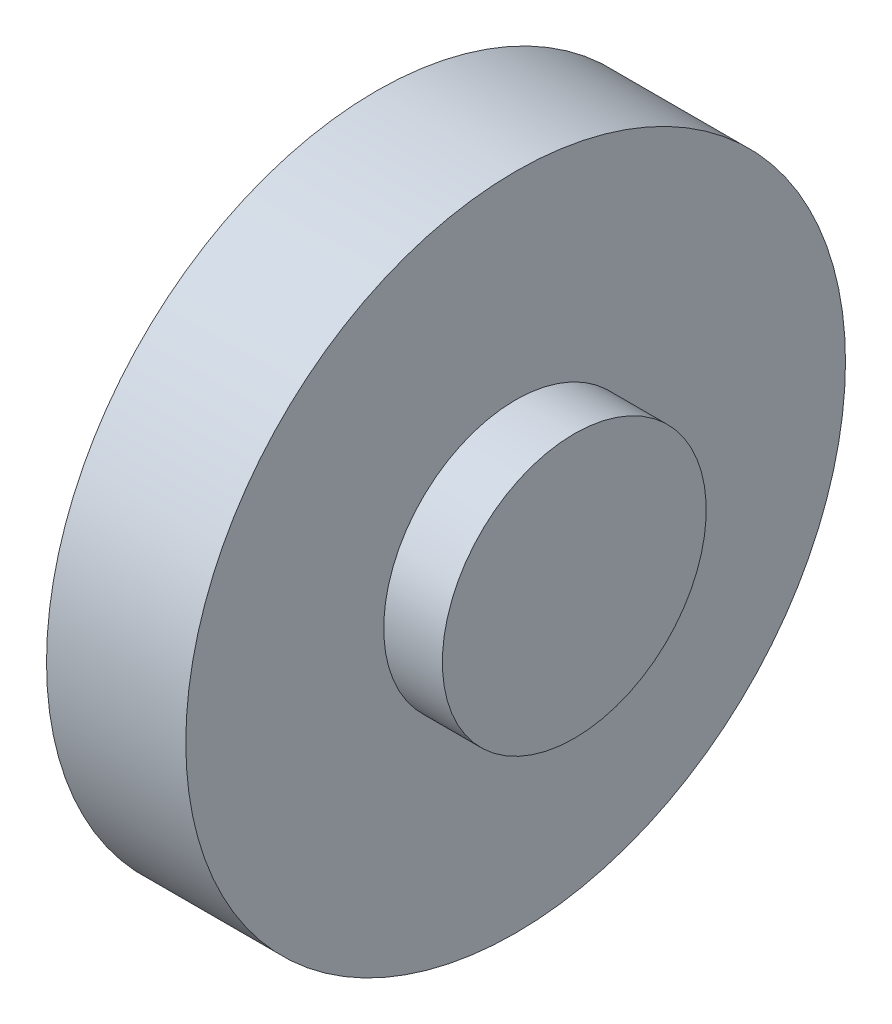
ISO-10303-21;
HEADER;
FILE_DESCRIPTION(('STEP AP214'),'2;1');
FILE_NAME('part.step','',(''),(''),'','','');
FILE_SCHEMA(('AUTOMOTIVE_DESIGN { 1 0 10303 214 1 1 1 1 }'));
ENDSEC;
DATA;
#1=APPLICATION_CONTEXT('core data for automotive mechanical design processes');
#2=APPLICATION_PROTOCOL_DEFINITION('international standard','automotive_design',2000,#1);
#3=PRODUCT_CONTEXT('',#1,'mechanical');
#4=PRODUCT('Part','Part','',(#3));
#5=PRODUCT_RELATED_PRODUCT_CATEGORY('part','',(#4));
#6=PRODUCT_DEFINITION_FORMATION('','',#4);
#7=PRODUCT_DEFINITION_CONTEXT('part definition',#1,'design');
#8=PRODUCT_DEFINITION('design','',#6,#7);
#9=PRODUCT_DEFINITION_SHAPE('','',#8);
#10=(LENGTH_UNIT() NAMED_UNIT(*) SI_UNIT(.MILLI.,.METRE.));
#11=(NAMED_UNIT(*) PLANE_ANGLE_UNIT() SI_UNIT($,.RADIAN.));
#12=(NAMED_UNIT(*) SI_UNIT($,.STERADIAN.) SOLID_ANGLE_UNIT());
#13=UNCERTAINTY_MEASURE_WITH_UNIT(LENGTH_MEASURE(1.E-05),#10,'distance_accuracy_value','');
#14=(GEOMETRIC_REPRESENTATION_CONTEXT(3) GLOBAL_UNCERTAINTY_ASSIGNED_CONTEXT((#13)) GLOBAL_UNIT_ASSIGNED_CONTEXT((#10,
#11,#12)) REPRESENTATION_CONTEXT('',''));
#15=CARTESIAN_POINT('',(0.,0.,0.));
#16=DIRECTION('',(0.,0.,1.));
#17=DIRECTION('',(1.,0.,0.));
#18=AXIS2_PLACEMENT_3D('',#15,#16,#17);
#19=CARTESIAN_POINT('',(0.,0.,0.));
#20=DIRECTION('',(1.,0.,0.));
#21=DIRECTION('',(0.,1.,0.));
#22=AXIS2_PLACEMENT_3D('',#19,#20,#21);
#23=PLANE('',#22);
#24=CARTESIAN_POINT('',(0.,0.,0.));
#25=DIRECTION('',(-1.,0.,0.));
#26=DIRECTION('',(0.,-1.,0.));
#27=AXIS2_PLACEMENT_3D('',#24,#25,#26);
#28=CIRCLE('',#27,9.99999999999999);
#29=CARTESIAN_POINT('',(0.,-9.99999999999999,0.));
#30=VERTEX_POINT('',#29);
#31=EDGE_CURVE('E10',#30,#30,#28,.T.);
#32=ORIENTED_EDGE('',*,*,#31,.T.);
#33=EDGE_LOOP('',(#32));
#34=FACE_BOUND('',#33,.T.);
#35=ADVANCED_FACE('F30',(#34),#23,.F.);
#36=CARTESIAN_POINT('',(-78.8778535634837,0.,0.));
#37=DIRECTION('',(-1.,0.,0.));
#38=DIRECTION('',(0.,-1.,0.));
#39=AXIS2_PLACEMENT_3D('',#36,#37,#38);
#40=CYLINDRICAL_SURFACE('',#39,9.99999999999999);
#41=ORIENTED_EDGE('',*,*,#31,.F.);
#42=EDGE_LOOP('',(#41));
#43=FACE_BOUND('',#42,.T.);
#44=CARTESIAN_POINT('',(9.99999999999999,0.,0.));
#45=DIRECTION('',(-1.,0.,0.));
#46=DIRECTION('',(0.,-1.,0.));
#47=AXIS2_PLACEMENT_3D('',#44,#45,#46);
#48=CIRCLE('',#47,10.);
#49=CARTESIAN_POINT('',(10.,-9.99999999999999,0.));
#50=VERTEX_POINT('',#49);
#51=EDGE_CURVE('E36',#50,#50,#48,.T.);
#52=ORIENTED_EDGE('',*,*,#51,.T.);
#53=EDGE_LOOP('',(#52));
#54=FACE_BOUND('',#53,.T.);
#55=ADVANCED_FACE('F68',(#43,#54),#40,.T.);
#56=CARTESIAN_POINT('',(10.,10.,0.));
#57=DIRECTION('',(1.,0.,0.));
#58=DIRECTION('',(0.,1.,0.));
#59=AXIS2_PLACEMENT_3D('',#56,#57,#58);
#60=PLANE('',#59);
#61=ORIENTED_EDGE('',*,*,#51,.F.);
#62=EDGE_LOOP('',(#61));
#63=FACE_BOUND('',#62,.T.);
#64=CARTESIAN_POINT('',(10.,0.,0.));
#65=DIRECTION('',(-1.,0.,0.));
#66=DIRECTION('',(0.,-1.,0.));
#67=AXIS2_PLACEMENT_3D('',#64,#65,#66);
#68=CIRCLE('',#67,45.);
#69=CARTESIAN_POINT('',(10.,-45.,0.));
#70=VERTEX_POINT('',#69);
#71=EDGE_CURVE('E40',#70,#70,#68,.T.);
#72=ORIENTED_EDGE('',*,*,#71,.T.);
#73=EDGE_LOOP('',(#72));
#74=FACE_BOUND('',#73,.T.);
#75=ADVANCED_FACE('F72',(#63,#74),#60,.F.);
#76=CARTESIAN_POINT('',(-78.8778535634837,0.,0.));
#77=DIRECTION('',(-1.,0.,0.));
#78=DIRECTION('',(0.,-1.,0.));
#79=AXIS2_PLACEMENT_3D('',#76,#77,#78);
#80=CYLINDRICAL_SURFACE('',#79,45.);
#81=ORIENTED_EDGE('',*,*,#71,.F.);
#82=EDGE_LOOP('',(#81));
#83=FACE_BOUND('',#82,.T.);
#84=CARTESIAN_POINT('',(29.,0.,0.));
#85=DIRECTION('',(-1.,0.,0.));
#86=DIRECTION('',(0.,-1.,0.));
#87=AXIS2_PLACEMENT_3D('',#84,#85,#86);
#88=CIRCLE('',#87,45.);
#89=CARTESIAN_POINT('',(29.,-45.,0.));
#90=VERTEX_POINT('',#89);
#91=EDGE_CURVE('E44',#90,#90,#88,.T.);
#92=ORIENTED_EDGE('',*,*,#91,.T.);
#93=EDGE_LOOP('',(#92));
#94=FACE_BOUND('',#93,.T.);
#95=ADVANCED_FACE('F77',(#83,#94),#80,.T.);
#96=CARTESIAN_POINT('',(29.,45.,0.));
#97=DIRECTION('',(-1.,0.,0.));
#98=DIRECTION('',(0.,-1.,0.));
#99=AXIS2_PLACEMENT_3D('',#96,#97,#98);
#100=PLANE('',#99);
#101=ORIENTED_EDGE('',*,*,#91,.F.);
#102=EDGE_LOOP('',(#101));
#103=FACE_BOUND('',#102,.T.);
#104=CARTESIAN_POINT('',(29.,0.,0.));
#105=DIRECTION('',(-1.,0.,0.));
#106=DIRECTION('',(0.,-1.,0.));
#107=AXIS2_PLACEMENT_3D('',#104,#105,#106);
#108=CIRCLE('',#107,18.);
#109=CARTESIAN_POINT('',(29.,-18.,0.));
#110=VERTEX_POINT('',#109);
#111=EDGE_CURVE('E49',#110,#110,#108,.T.);
#112=ORIENTED_EDGE('',*,*,#111,.T.);
#113=EDGE_LOOP('',(#112));
#114=FACE_BOUND('',#113,.T.);
#115=ADVANCED_FACE('F64',(#103,#114),#100,.F.);
#116=CARTESIAN_POINT('',(-78.8778535634837,0.,0.));
#117=DIRECTION('',(-1.,0.,0.));
#118=DIRECTION('',(0.,-1.,0.));
#119=AXIS2_PLACEMENT_3D('',#116,#117,#118);
#120=CYLINDRICAL_SURFACE('',#119,18.);
#121=ORIENTED_EDGE('',*,*,#111,.F.);
#122=EDGE_LOOP('',(#121));
#123=FACE_BOUND('',#122,.T.);
#124=CARTESIAN_POINT('',(37.,0.,0.));
#125=DIRECTION('',(-1.,0.,0.));
#126=DIRECTION('',(0.,-1.,0.));
#127=AXIS2_PLACEMENT_3D('',#124,#125,#126);
#128=CIRCLE('',#127,18.);
#129=CARTESIAN_POINT('',(37.,-18.,0.));
#130=VERTEX_POINT('',#129);
#131=EDGE_CURVE('E52',#130,#130,#128,.T.);
#132=ORIENTED_EDGE('',*,*,#131,.T.);
#133=EDGE_LOOP('',(#132));
#134=FACE_BOUND('',#133,.T.);
#135=ADVANCED_FACE('F56',(#123,#134),#120,.T.);
#136=CARTESIAN_POINT('',(37.,18.,0.));
#137=DIRECTION('',(-1.,0.,0.));
#138=DIRECTION('',(0.,-1.,0.));
#139=AXIS2_PLACEMENT_3D('',#136,#137,#138);
#140=PLANE('',#139);
#141=ORIENTED_EDGE('',*,*,#131,.F.);
#142=EDGE_LOOP('',(#141));
#143=FACE_BOUND('',#142,.T.);
#144=ADVANCED_FACE('F58',(#143),#140,.F.);
#145=CLOSED_SHELL('',(#35,#55,#75,#95,#115,#135,#144));
#146=MANIFOLD_SOLID_BREP('B2',#145);
#147=ADVANCED_BREP_SHAPE_REPRESENTATION('',(#18,#146),#14);
#148=SHAPE_DEFINITION_REPRESENTATION(#9,#147);
ENDSEC;
END-ISO-10303-21;
